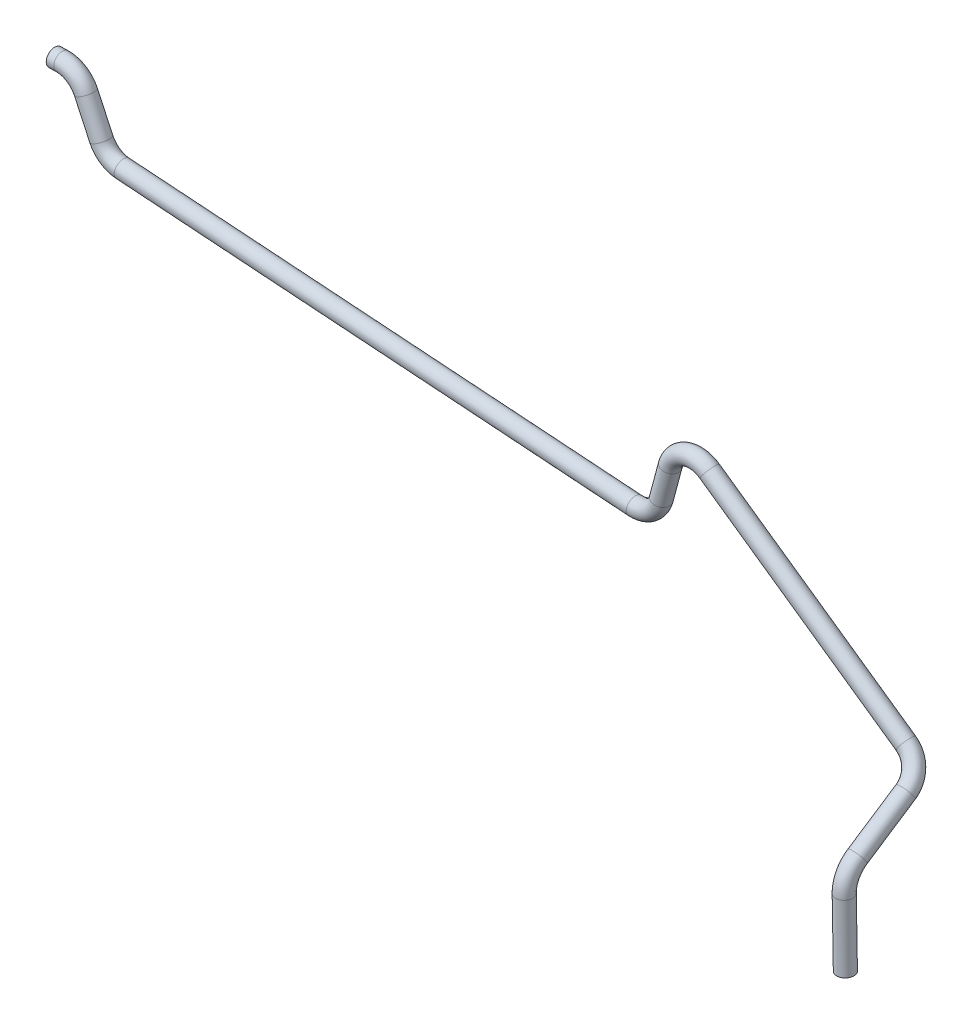
ISO-10303-21;
HEADER;
FILE_DESCRIPTION(('STEP AP214'),'2;1');
FILE_NAME('part.step','',(''),(''),'','','');
FILE_SCHEMA(('AUTOMOTIVE_DESIGN { 1 0 10303 214 1 1 1 1 }'));
ENDSEC;
DATA;
#1=APPLICATION_CONTEXT('core data for automotive mechanical design processes');
#2=APPLICATION_PROTOCOL_DEFINITION('international standard','automotive_design',2000,#1);
#3=PRODUCT_CONTEXT('',#1,'mechanical');
#4=PRODUCT('Part','Part','',(#3));
#5=PRODUCT_RELATED_PRODUCT_CATEGORY('part','',(#4));
#6=PRODUCT_DEFINITION_FORMATION('','',#4);
#7=PRODUCT_DEFINITION_CONTEXT('part definition',#1,'design');
#8=PRODUCT_DEFINITION('design','',#6,#7);
#9=PRODUCT_DEFINITION_SHAPE('','',#8);
#10=(LENGTH_UNIT() NAMED_UNIT(*) SI_UNIT(.MILLI.,.METRE.));
#11=(NAMED_UNIT(*) PLANE_ANGLE_UNIT() SI_UNIT($,.RADIAN.));
#12=(NAMED_UNIT(*) SI_UNIT($,.STERADIAN.) SOLID_ANGLE_UNIT());
#13=UNCERTAINTY_MEASURE_WITH_UNIT(LENGTH_MEASURE(1.E-05),#10,'distance_accuracy_value','');
#14=(GEOMETRIC_REPRESENTATION_CONTEXT(3) GLOBAL_UNCERTAINTY_ASSIGNED_CONTEXT((#13)) GLOBAL_UNIT_ASSIGNED_CONTEXT((#10,
#11,#12)) REPRESENTATION_CONTEXT('',''));
#15=CARTESIAN_POINT('',(0.,0.,0.));
#16=DIRECTION('',(0.,0.,1.));
#17=DIRECTION('',(1.,0.,0.));
#18=AXIS2_PLACEMENT_3D('',#15,#16,#17);
#19=CARTESIAN_POINT('',(38.6600474327083,6.46216773713733,-0.635));
#20=DIRECTION('',(-0.0174524064372786,0.999847695156391,0.));
#21=DIRECTION('',(-0.999847695156391,-0.0174524064372786,0.));
#22=AXIS2_PLACEMENT_3D('',#19,#20,#21);
#23=PLANE('',#22);
#24=CARTESIAN_POINT('',(38.6600474327083,6.46216773713733,-0.635));
#25=DIRECTION('',(0.0174524064372838,-0.999847695156391,0.));
#26=DIRECTION('',(0.999847695156391,0.0174524064372838,0.));
#27=AXIS2_PLACEMENT_3D('',#24,#25,#26);
#28=CIRCLE('',#27,0.635);
#29=CARTESIAN_POINT('',(39.2949507191326,6.473250015225,-0.635));
#30=VERTEX_POINT('',#29);
#31=EDGE_CURVE('E18',#30,#30,#28,.F.);
#32=ORIENTED_EDGE('',*,*,#31,.F.);
#33=EDGE_LOOP('',(#32));
#34=FACE_BOUND('',#33,.T.);
#35=ADVANCED_FACE('F15',(#34),#23,.F.);
#36=CARTESIAN_POINT('',(38.5734530890992,11.423154359942,-0.635));
#37=DIRECTION('',(0.0174524064372838,-0.999847695156391,0.));
#38=DIRECTION('',(0.999847695156391,0.0174524064372838,0.));
#39=AXIS2_PLACEMENT_3D('',#36,#37,#38);
#40=CYLINDRICAL_SURFACE('',#39,0.635);
#41=CARTESIAN_POINT('',(38.5734530890992,11.423154359942,-0.634999999999993));
#42=DIRECTION('',(0.0174524064372852,-0.999847695156391,0.));
#43=DIRECTION('',(0.,0.,1.));
#44=AXIS2_PLACEMENT_3D('',#41,#42,#43);
#45=CIRCLE('',#44,0.635);
#46=CARTESIAN_POINT('',(38.5734530890992,11.423154359942,0.));
#47=VERTEX_POINT('',#46);
#48=EDGE_CURVE('E110',#47,#47,#45,.F.);
#49=ORIENTED_EDGE('',*,*,#48,.F.);
#50=EDGE_LOOP('',(#49));
#51=FACE_BOUND('',#50,.T.);
#52=ORIENTED_EDGE('',*,*,#31,.T.);
#53=EDGE_LOOP('',(#52));
#54=FACE_BOUND('',#53,.T.);
#55=ADVANCED_FACE('F106',(#51,#54),#40,.T.);
#56=CARTESIAN_POINT('',(38.5734530890992,11.423154359942,-2.84677859128232));
#57=DIRECTION('',(0.999847695156391,0.0174524064372852,0.));
#58=DIRECTION('',(0.0174524064372852,-0.999847695156391,0.));
#59=AXIS2_PLACEMENT_3D('',#56,#57,#58);
#60=TOROIDAL_SURFACE('',#59,2.21177859128233,0.635);
#61=ORIENTED_EDGE('',*,*,#48,.T.);
#62=EDGE_LOOP('',(#61));
#63=FACE_BOUND('',#62,.T.);
#64=CARTESIAN_POINT('',(38.5409633769766,13.2844887208416,-1.65248241679484));
#65=DIRECTION('',(0.00942379238401284,-0.539888704096318,0.841683657514093));
#66=DIRECTION('',(0.,-0.84172103406704,-0.539912678874198));
#67=AXIS2_PLACEMENT_3D('',#64,#65,#66);
#68=CIRCLE('',#67,0.634999999999999);
#69=CARTESIAN_POINT('',(38.5409633769766,12.749995864209,-1.99532696787996));
#70=VERTEX_POINT('',#69);
#71=EDGE_CURVE('E113',#70,#70,#68,.F.);
#72=ORIENTED_EDGE('',*,*,#71,.F.);
#73=EDGE_LOOP('',(#72));
#74=FACE_BOUND('',#73,.T.);
#75=ADVANCED_FACE('F102',(#63,#74),#60,.T.);
#76=CARTESIAN_POINT('',(38.5004637259128,15.6047121763454,-5.26969861239433));
#77=DIRECTION('',(0.00942379238401284,-0.539888704096318,0.841683657514093));
#78=DIRECTION('',(0.,-0.84172103406704,-0.539912678874198));
#79=AXIS2_PLACEMENT_3D('',#76,#77,#78);
#80=CYLINDRICAL_SURFACE('',#79,0.634999999999999);
#81=CARTESIAN_POINT('',(38.5004637259128,15.6047121763454,-5.26969861239432));
#82=DIRECTION('',(0.00942379238401178,-0.539888704096316,0.841683657514095));
#83=DIRECTION('',(0.860660550843084,-0.424153170389216,-0.281704640130858));
#84=AXIS2_PLACEMENT_3D('',#81,#82,#83);
#85=CIRCLE('',#84,0.635);
#86=CARTESIAN_POINT('',(39.0469831756982,15.3353749131482,-5.44858105887741));
#87=VERTEX_POINT('',#86);
#88=EDGE_CURVE('E87',#87,#87,#85,.F.);
#89=ORIENTED_EDGE('',*,*,#88,.F.);
#90=EDGE_LOOP('',(#89));
#91=FACE_BOUND('',#90,.T.);
#92=ORIENTED_EDGE('',*,*,#71,.T.);
#93=EDGE_LOOP('',(#92));
#94=FACE_BOUND('',#93,.T.);
#95=ADVANCED_FACE('F98',(#91,#94),#80,.T.);
#96=CARTESIAN_POINT('',(-26.1548363904053,29.94790384789,-6.6313785912823));
#97=DIRECTION('',(-0.999847695156391,-0.0174524064372838,0.));
#98=DIRECTION('',(0.0174524064372838,-0.999847695156391,0.));
#99=AXIS2_PLACEMENT_3D('',#96,#97,#98);
#100=PLANE('',#99);
#101=CARTESIAN_POINT('',(-26.1548363904053,29.9479038478899,-6.6313785912823));
#102=DIRECTION('',(-0.999847695156391,-0.0174524064372838,0.));
#103=DIRECTION('',(0.0174524064372838,-0.999847695156391,0.));
#104=AXIS2_PLACEMENT_3D('',#101,#102,#103);
#105=CIRCLE('',#104,0.635);
#106=CARTESIAN_POINT('',(-26.1437541123176,29.3130005614656,-6.6313785912823));
#107=VERTEX_POINT('',#106);
#108=EDGE_CURVE('E84',#107,#107,#105,.F.);
#109=ORIENTED_EDGE('',*,*,#108,.F.);
#110=EDGE_LOOP('',(#109));
#111=FACE_BOUND('',#110,.T.);
#112=ADVANCED_FACE('F94',(#111),#100,.T.);
#113=CARTESIAN_POINT('',(36.5661476412844,16.5579873079013,-4.63657349008473));
#114=DIRECTION('',(-0.509091944897561,-0.727058646353909,-0.460663778044726));
#115=DIRECTION('',(-0.819152044288989,0.573576436351051,0.));
#116=AXIS2_PLACEMENT_3D('',#113,#114,#115);
#117=TOROIDAL_SURFACE('',#116,2.2474785009416,0.635);
#118=ORIENTED_EDGE('',*,*,#88,.T.);
#119=EDGE_LOOP('',(#118));
#120=FACE_BOUND('',#119,.T.);
#121=CARTESIAN_POINT('',(37.1599896443317,17.4060815808731,-6.63137859128233));
#122=DIRECTION('',(0.81915204428899,-0.573576436351049,0.));
#123=DIRECTION('',(0.573576436351049,0.81915204428899,0.));
#124=AXIS2_PLACEMENT_3D('',#121,#122,#123);
#125=CIRCLE('',#124,0.635);
#126=CARTESIAN_POINT('',(37.5242106814147,17.9262431289967,-6.63137859128233));
#127=VERTEX_POINT('',#126);
#128=EDGE_CURVE('E80',#127,#127,#125,.F.);
#129=ORIENTED_EDGE('',*,*,#128,.F.);
#130=EDGE_LOOP('',(#129));
#131=FACE_BOUND('',#130,.T.);
#132=ADVANCED_FACE('F90',(#120,#131),#117,.T.);
#133=CARTESIAN_POINT('',(-25.5946170142487,29.9576825134748,-6.6313785912823));
#134=DIRECTION('',(-0.999847695156391,-0.0174524064372838,0.));
#135=DIRECTION('',(0.0174524064372838,-0.999847695156391,0.));
#136=AXIS2_PLACEMENT_3D('',#133,#134,#135);
#137=CYLINDRICAL_SURFACE('',#136,0.635);
#138=ORIENTED_EDGE('',*,*,#108,.T.);
#139=EDGE_LOOP('',(#138));
#140=FACE_BOUND('',#139,.T.);
#141=CARTESIAN_POINT('',(-25.5946170142487,29.9576825134748,-6.6313785912823));
#142=DIRECTION('',(0.999847695156391,0.0174524064372834,0.));
#143=DIRECTION('',(-0.0174524064372807,0.999847695156391,0.));
#144=AXIS2_PLACEMENT_3D('',#141,#142,#143);
#145=CIRCLE('',#144,0.635);
#146=CARTESIAN_POINT('',(-25.6056992923364,30.5925857998991,-6.6313785912823));
#147=VERTEX_POINT('',#146);
#148=EDGE_CURVE('E83',#147,#147,#145,.T.);
#149=ORIENTED_EDGE('',*,*,#148,.F.);
#150=EDGE_LOOP('',(#149));
#151=FACE_BOUND('',#150,.T.);
#152=ADVANCED_FACE('F93',(#140,#151),#137,.T.);
#153=CARTESIAN_POINT('',(22.570806492228,27.6215376002983,-6.63137859128232));
#154=DIRECTION('',(0.81915204428899,-0.573576436351049,0.));
#155=DIRECTION('',(0.573576436351049,0.81915204428899,0.));
#156=AXIS2_PLACEMENT_3D('',#153,#154,#155);
#157=CYLINDRICAL_SURFACE('',#156,0.635);
#158=CARTESIAN_POINT('',(22.570806492228,27.6215376002983,-6.63137859128232));
#159=DIRECTION('',(0.819152044288992,-0.573576436351046,0.));
#160=DIRECTION('',(0.573576436351044,0.819152044288994,0.));
#161=AXIS2_PLACEMENT_3D('',#158,#159,#160);
#162=CIRCLE('',#161,0.635);
#163=CARTESIAN_POINT('',(22.9350275293109,28.1416991484218,-6.63137859128232));
#164=VERTEX_POINT('',#163);
#165=EDGE_CURVE('E62',#164,#164,#162,.F.);
#166=ORIENTED_EDGE('',*,*,#165,.F.);
#167=EDGE_LOOP('',(#166));
#168=FACE_BOUND('',#167,.T.);
#169=ORIENTED_EDGE('',*,*,#128,.T.);
#170=EDGE_LOOP('',(#169));
#171=FACE_BOUND('',#170,.T.);
#172=ADVANCED_FACE('F75',(#168,#171),#157,.T.);
#173=CARTESIAN_POINT('',(-25.5613701799857,28.0529726542019,-6.6313785912823));
#174=DIRECTION('',(0.,0.,-1.));
#175=DIRECTION('',(-0.999847695156391,-0.0174524064372829,0.));
#176=AXIS2_PLACEMENT_3D('',#173,#174,#175);
#177=TOROIDAL_SURFACE('',#176,1.905,0.635);
#178=ORIENTED_EDGE('',*,*,#148,.T.);
#179=EDGE_LOOP('',(#178));
#180=FACE_BOUND('',#179,.T.);
#181=CARTESIAN_POINT('',(-23.8348538456809,28.8580604428178,-6.6313785912823));
#182=DIRECTION('',(0.422618261740695,-0.906307787036652,0.));
#183=DIRECTION('',(0.906307787036652,0.422618261740695,0.));
#184=AXIS2_PLACEMENT_3D('',#181,#182,#183);
#185=CIRCLE('',#184,0.635);
#186=CARTESIAN_POINT('',(-23.2593484009126,29.1264230390232,-6.6313785912823));
#187=VERTEX_POINT('',#186);
#188=EDGE_CURVE('E59',#187,#187,#185,.T.);
#189=ORIENTED_EDGE('',*,*,#188,.F.);
#190=EDGE_LOOP('',(#189));
#191=FACE_BOUND('',#190,.T.);
#192=ADVANCED_FACE('F71',(#180,#191),#177,.T.);
#193=CARTESIAN_POINT('',(21.4781433809793,26.0610529559278,-6.63137859128232));
#194=DIRECTION('',(0.,0.,-1.));
#195=DIRECTION('',(-0.999847695156391,-0.0174524064372847,0.));
#196=AXIS2_PLACEMENT_3D('',#193,#194,#195);
#197=TOROIDAL_SURFACE('',#196,1.905,0.635);
#198=CARTESIAN_POINT('',(19.6380546818986,26.5541032368481,-6.63137859128232));
#199=DIRECTION('',(0.258819045102521,0.965925826289068,0.));
#200=DIRECTION('',(-0.965925826289068,0.258819045102521,0.));
#201=AXIS2_PLACEMENT_3D('',#198,#199,#200);
#202=CIRCLE('',#201,0.635);
#203=CARTESIAN_POINT('',(19.024691782205,26.7184533304882,-6.63137859128232));
#204=VERTEX_POINT('',#203);
#205=EDGE_CURVE('E55',#204,#204,#202,.F.);
#206=ORIENTED_EDGE('',*,*,#205,.F.);
#207=EDGE_LOOP('',(#206));
#208=FACE_BOUND('',#207,.T.);
#209=ORIENTED_EDGE('',*,*,#165,.T.);
#210=EDGE_LOOP('',(#209));
#211=FACE_BOUND('',#210,.T.);
#212=ADVANCED_FACE('F67',(#208,#211),#197,.T.);
#213=CARTESIAN_POINT('',(-23.8348538456809,28.8580604428178,-6.6313785912823));
#214=DIRECTION('',(0.422618261740695,-0.906307787036652,0.));
#215=DIRECTION('',(0.906307787036652,0.422618261740695,0.));
#216=AXIS2_PLACEMENT_3D('',#213,#214,#215);
#217=CYLINDRICAL_SURFACE('',#216,0.635);
#218=ORIENTED_EDGE('',*,*,#188,.T.);
#219=EDGE_LOOP('',(#218));
#220=FACE_BOUND('',#219,.T.);
#221=CARTESIAN_POINT('',(-22.6904807027906,26.4039443182444,-6.6313785912823));
#222=DIRECTION('',(0.422618261740705,-0.906307787036647,0.));
#223=DIRECTION('',(-0.906307787036648,-0.422618261740702,0.));
#224=AXIS2_PLACEMENT_3D('',#221,#222,#223);
#225=CIRCLE('',#224,0.635);
#226=CARTESIAN_POINT('',(-23.2659861475588,26.135581722039,-6.63137859128231));
#227=VERTEX_POINT('',#226);
#228=EDGE_CURVE('E52',#227,#227,#225,.T.);
#229=ORIENTED_EDGE('',*,*,#228,.F.);
#230=EDGE_LOOP('',(#229));
#231=FACE_BOUND('',#230,.T.);
#232=ADVANCED_FACE('F70',(#220,#231),#217,.T.);
#233=CARTESIAN_POINT('',(18.9677141696159,24.0523583866374,-6.63137859128232));
#234=DIRECTION('',(0.258819045102521,0.965925826289068,0.));
#235=DIRECTION('',(-0.965925826289068,0.258819045102521,0.));
#236=AXIS2_PLACEMENT_3D('',#233,#234,#235);
#237=CYLINDRICAL_SURFACE('',#236,0.635);
#238=CARTESIAN_POINT('',(18.9677141696159,24.0523583866373,-6.63137859128232));
#239=DIRECTION('',(0.258819045102525,0.965925826289067,0.));
#240=DIRECTION('',(0.965925826289068,-0.258819045102522,0.));
#241=AXIS2_PLACEMENT_3D('',#238,#239,#240);
#242=CIRCLE('',#241,0.635);
#243=CARTESIAN_POINT('',(19.5810770693095,23.8880082929972,-6.63137859128232));
#244=VERTEX_POINT('',#243);
#245=EDGE_CURVE('E31',#244,#244,#242,.F.);
#246=ORIENTED_EDGE('',*,*,#245,.F.);
#247=EDGE_LOOP('',(#246));
#248=FACE_BOUND('',#247,.T.);
#249=ORIENTED_EDGE('',*,*,#205,.T.);
#250=EDGE_LOOP('',(#249));
#251=FACE_BOUND('',#250,.T.);
#252=ADVANCED_FACE('F47',(#248,#251),#237,.T.);
#253=CARTESIAN_POINT('',(-20.9639643684858,27.2090321068604,-6.6313785912823));
#254=DIRECTION('',(0.,0.,1.));
#255=DIRECTION('',(0.999847695156391,0.0174524064372829,0.));
#256=AXIS2_PLACEMENT_3D('',#253,#254,#255);
#257=TOROIDAL_SURFACE('',#256,1.905,0.635);
#258=CARTESIAN_POINT('',(-21.0968504509683,25.3086725911154,-6.6313785912823));
#259=DIRECTION('',(0.997564050259824,-0.0697564737441325,0.));
#260=DIRECTION('',(0.0697564737441325,0.997564050259824,0.));
#261=AXIS2_PLACEMENT_3D('',#258,#259,#260);
#262=CIRCLE('',#261,0.635);
#263=CARTESIAN_POINT('',(-21.0525550901408,25.9421257630304,-6.6313785912823));
#264=VERTEX_POINT('',#263);
#265=EDGE_CURVE('E23',#264,#264,#262,.T.);
#266=ORIENTED_EDGE('',*,*,#265,.F.);
#267=EDGE_LOOP('',(#266));
#268=FACE_BOUND('',#267,.T.);
#269=ORIENTED_EDGE('',*,*,#228,.T.);
#270=EDGE_LOOP('',(#269));
#271=FACE_BOUND('',#270,.T.);
#272=ADVANCED_FACE('F43',(#268,#271),#257,.T.);
#273=CARTESIAN_POINT('',(17.1276254705352,24.5454086675576,-6.63137859128232));
#274=DIRECTION('',(0.,0.,1.));
#275=DIRECTION('',(-0.0174524064372847,0.999847695156391,0.));
#276=AXIS2_PLACEMENT_3D('',#273,#274,#275);
#277=TOROIDAL_SURFACE('',#276,1.905,0.635);
#278=ORIENTED_EDGE('',*,*,#245,.T.);
#279=EDGE_LOOP('',(#278));
#280=FACE_BOUND('',#279,.T.);
#281=CARTESIAN_POINT('',(16.9947393880526,22.6450491518126,-6.63137859128231));
#282=DIRECTION('',(0.997564050259824,-0.0697564737441325,0.));
#283=DIRECTION('',(0.0697564737441325,0.997564050259824,0.));
#284=AXIS2_PLACEMENT_3D('',#281,#282,#283);
#285=CIRCLE('',#284,0.635);
#286=CARTESIAN_POINT('',(17.0390347488801,23.2785023237276,-6.63137859128231));
#287=VERTEX_POINT('',#286);
#288=EDGE_CURVE('E10',#287,#287,#285,.F.);
#289=ORIENTED_EDGE('',*,*,#288,.F.);
#290=EDGE_LOOP('',(#289));
#291=FACE_BOUND('',#290,.T.);
#292=ADVANCED_FACE('F38',(#280,#291),#277,.T.);
#293=CARTESIAN_POINT('',(-21.0968504509684,25.3086725911154,-6.6313785912823));
#294=DIRECTION('',(0.997564050259824,-0.0697564737441325,0.));
#295=DIRECTION('',(0.0697564737441325,0.997564050259824,0.));
#296=AXIS2_PLACEMENT_3D('',#293,#294,#295);
#297=CYLINDRICAL_SURFACE('',#296,0.635);
#298=ORIENTED_EDGE('',*,*,#265,.T.);
#299=EDGE_LOOP('',(#298));
#300=FACE_BOUND('',#299,.T.);
#301=ORIENTED_EDGE('',*,*,#288,.T.);
#302=EDGE_LOOP('',(#301));
#303=FACE_BOUND('',#302,.T.);
#304=ADVANCED_FACE('F42',(#300,#303),#297,.T.);
#305=CLOSED_SHELL('',(#35,#55,#75,#95,#112,#132,#152,#172,#192,#212,#232,#252,#272,#292,#304));
#306=MANIFOLD_SOLID_BREP('B1',#305);
#307=ADVANCED_BREP_SHAPE_REPRESENTATION('',(#18,#306),#14);
#308=SHAPE_DEFINITION_REPRESENTATION(#9,#307);
ENDSEC;
END-ISO-10303-21;
